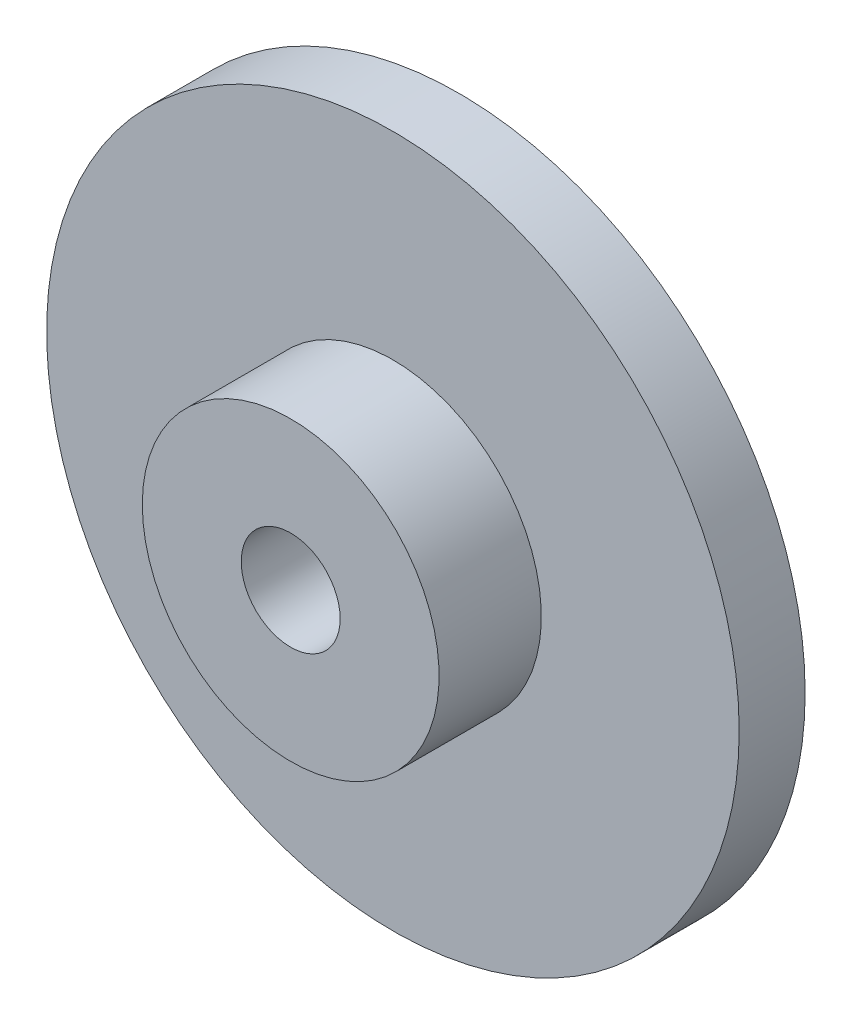
ISO-10303-21;
HEADER;
FILE_DESCRIPTION(('STEP AP214'),'2;1');
FILE_NAME('part.step','',(''),(''),'','','');
FILE_SCHEMA(('AUTOMOTIVE_DESIGN { 1 0 10303 214 1 1 1 1 }'));
ENDSEC;
DATA;
#1=APPLICATION_CONTEXT('core data for automotive mechanical design processes');
#2=APPLICATION_PROTOCOL_DEFINITION('international standard','automotive_design',2000,#1);
#3=PRODUCT_CONTEXT('',#1,'mechanical');
#4=PRODUCT('Part','Part','',(#3));
#5=PRODUCT_RELATED_PRODUCT_CATEGORY('part','',(#4));
#6=PRODUCT_DEFINITION_FORMATION('','',#4);
#7=PRODUCT_DEFINITION_CONTEXT('part definition',#1,'design');
#8=PRODUCT_DEFINITION('design','',#6,#7);
#9=PRODUCT_DEFINITION_SHAPE('','',#8);
#10=(LENGTH_UNIT() NAMED_UNIT(*) SI_UNIT(.MILLI.,.METRE.));
#11=(NAMED_UNIT(*) PLANE_ANGLE_UNIT() SI_UNIT($,.RADIAN.));
#12=(NAMED_UNIT(*) SI_UNIT($,.STERADIAN.) SOLID_ANGLE_UNIT());
#13=UNCERTAINTY_MEASURE_WITH_UNIT(LENGTH_MEASURE(1.E-05),#10,'distance_accuracy_value','');
#14=(GEOMETRIC_REPRESENTATION_CONTEXT(3) GLOBAL_UNCERTAINTY_ASSIGNED_CONTEXT((#13)) GLOBAL_UNIT_ASSIGNED_CONTEXT((#10,
#11,#12)) REPRESENTATION_CONTEXT('',''));
#15=CARTESIAN_POINT('',(0.,0.,0.));
#16=DIRECTION('',(0.,0.,1.));
#17=DIRECTION('',(1.,0.,0.));
#18=AXIS2_PLACEMENT_3D('',#15,#16,#17);
#19=CARTESIAN_POINT('',(0.,0.,2.));
#20=DIRECTION('',(0.,0.,1.));
#21=DIRECTION('',(1.,0.,0.));
#22=AXIS2_PLACEMENT_3D('',#19,#20,#21);
#23=PLANE('',#22);
#24=CARTESIAN_POINT('',(0.,0.,2.));
#25=DIRECTION('',(0.,0.,1.));
#26=DIRECTION('',(1.,0.,0.));
#27=AXIS2_PLACEMENT_3D('',#24,#25,#26);
#28=CIRCLE('',#27,10.5);
#29=CARTESIAN_POINT('',(10.5,0.,2.));
#30=VERTEX_POINT('',#29);
#31=EDGE_CURVE('E10',#30,#30,#28,.T.);
#32=ORIENTED_EDGE('',*,*,#31,.T.);
#33=EDGE_LOOP('',(#32));
#34=FACE_BOUND('',#33,.T.);
#35=CARTESIAN_POINT('',(0.,0.,2.));
#36=DIRECTION('',(0.,0.,1.));
#37=DIRECTION('',(1.,0.,0.));
#38=AXIS2_PLACEMENT_3D('',#35,#36,#37);
#39=CIRCLE('',#38,4.5);
#40=CARTESIAN_POINT('',(-4.5,0.,2.));
#41=VERTEX_POINT('',#40);
#42=EDGE_CURVE('E48',#41,#41,#39,.T.);
#43=ORIENTED_EDGE('',*,*,#42,.F.);
#44=EDGE_LOOP('',(#43));
#45=FACE_BOUND('',#44,.T.);
#46=ADVANCED_FACE('F35',(#34,#45),#23,.T.);
#47=CARTESIAN_POINT('',(0.,0.,2.));
#48=DIRECTION('',(0.,0.,-1.));
#49=DIRECTION('',(-1.,0.,0.));
#50=AXIS2_PLACEMENT_3D('',#47,#48,#49);
#51=CYLINDRICAL_SURFACE('',#50,10.5);
#52=ORIENTED_EDGE('',*,*,#31,.F.);
#53=EDGE_LOOP('',(#52));
#54=FACE_BOUND('',#53,.T.);
#55=CARTESIAN_POINT('',(0.,0.,0.));
#56=DIRECTION('',(0.,0.,1.));
#57=DIRECTION('',(1.,0.,0.));
#58=AXIS2_PLACEMENT_3D('',#55,#56,#57);
#59=CIRCLE('',#58,10.5);
#60=CARTESIAN_POINT('',(10.5,0.,0.));
#61=VERTEX_POINT('',#60);
#62=EDGE_CURVE('E39',#61,#61,#59,.T.);
#63=ORIENTED_EDGE('',*,*,#62,.T.);
#64=EDGE_LOOP('',(#63));
#65=FACE_BOUND('',#64,.T.);
#66=ADVANCED_FACE('F37',(#54,#65),#51,.T.);
#67=CARTESIAN_POINT('',(0.,0.,0.));
#68=DIRECTION('',(0.,0.,1.));
#69=DIRECTION('',(1.,0.,0.));
#70=AXIS2_PLACEMENT_3D('',#67,#68,#69);
#71=PLANE('',#70);
#72=CARTESIAN_POINT('',(0.,0.,0.));
#73=DIRECTION('',(0.,0.,1.));
#74=DIRECTION('',(1.,0.,0.));
#75=AXIS2_PLACEMENT_3D('',#72,#73,#74);
#76=CIRCLE('',#75,1.5);
#77=CARTESIAN_POINT('',(1.5,0.,0.));
#78=VERTEX_POINT('',#77);
#79=EDGE_CURVE('E51',#78,#78,#76,.F.);
#80=ORIENTED_EDGE('',*,*,#79,.F.);
#81=EDGE_LOOP('',(#80));
#82=FACE_BOUND('',#81,.T.);
#83=ORIENTED_EDGE('',*,*,#62,.F.);
#84=EDGE_LOOP('',(#83));
#85=FACE_BOUND('',#84,.T.);
#86=ADVANCED_FACE('F72',(#82,#85),#71,.F.);
#87=CARTESIAN_POINT('',(0.,0.,5.1));
#88=DIRECTION('',(0.,0.,-1.));
#89=DIRECTION('',(-1.,0.,0.));
#90=AXIS2_PLACEMENT_3D('',#87,#88,#89);
#91=CYLINDRICAL_SURFACE('',#90,4.5);
#92=CARTESIAN_POINT('',(0.,0.,5.1));
#93=DIRECTION('',(0.,0.,1.));
#94=DIRECTION('',(1.,0.,0.));
#95=AXIS2_PLACEMENT_3D('',#92,#93,#94);
#96=CIRCLE('',#95,4.5);
#97=CARTESIAN_POINT('',(-4.5,0.,5.1));
#98=VERTEX_POINT('',#97);
#99=EDGE_CURVE('E46',#98,#98,#96,.T.);
#100=CARTESIAN_POINT('',(-4.5,0.,5.1));
#101=CARTESIAN_POINT('',(-4.5,0.,5.06770833333333));
#102=CARTESIAN_POINT('',(-4.5,0.,5.03541666666667));
#103=CARTESIAN_POINT('',(-4.5,0.,4.97083333333333));
#104=CARTESIAN_POINT('',(-4.5,0.,4.93854166666667));
#105=CARTESIAN_POINT('',(-4.5,0.,4.87395833333333));
#106=CARTESIAN_POINT('',(-4.5,0.,4.84166666666667));
#107=CARTESIAN_POINT('',(-4.5,0.,4.77708333333333));
#108=CARTESIAN_POINT('',(-4.5,0.,4.74479166666667));
#109=CARTESIAN_POINT('',(-4.5,0.,4.68020833333333));
#110=CARTESIAN_POINT('',(-4.5,0.,4.64791666666667));
#111=CARTESIAN_POINT('',(-4.5,0.,4.58333333333333));
#112=CARTESIAN_POINT('',(-4.5,0.,4.55104166666667));
#113=CARTESIAN_POINT('',(-4.5,0.,4.48645833333333));
#114=CARTESIAN_POINT('',(-4.5,0.,4.45416666666667));
#115=CARTESIAN_POINT('',(-4.5,0.,4.38958333333333));
#116=CARTESIAN_POINT('',(-4.5,0.,4.35729166666667));
#117=CARTESIAN_POINT('',(-4.5,0.,4.29270833333333));
#118=CARTESIAN_POINT('',(-4.5,0.,4.26041666666667));
#119=CARTESIAN_POINT('',(-4.5,0.,4.19583333333333));
#120=CARTESIAN_POINT('',(-4.5,0.,4.16354166666667));
#121=CARTESIAN_POINT('',(-4.5,0.,4.09895833333333));
#122=CARTESIAN_POINT('',(-4.5,0.,4.06666666666667));
#123=CARTESIAN_POINT('',(-4.5,0.,4.00208333333333));
#124=CARTESIAN_POINT('',(-4.5,0.,3.96979166666667));
#125=CARTESIAN_POINT('',(-4.5,0.,3.90520833333333));
#126=CARTESIAN_POINT('',(-4.5,0.,3.87291666666667));
#127=CARTESIAN_POINT('',(-4.5,0.,3.80833333333333));
#128=CARTESIAN_POINT('',(-4.5,0.,3.77604166666667));
#129=CARTESIAN_POINT('',(-4.5,0.,3.71145833333333));
#130=CARTESIAN_POINT('',(-4.5,0.,3.67916666666667));
#131=CARTESIAN_POINT('',(-4.5,0.,3.61458333333333));
#132=CARTESIAN_POINT('',(-4.5,0.,3.58229166666667));
#133=CARTESIAN_POINT('',(-4.5,0.,3.51770833333333));
#134=CARTESIAN_POINT('',(-4.5,0.,3.48541666666667));
#135=CARTESIAN_POINT('',(-4.5,0.,3.42083333333333));
#136=CARTESIAN_POINT('',(-4.5,0.,3.38854166666667));
#137=CARTESIAN_POINT('',(-4.5,0.,3.32395833333333));
#138=CARTESIAN_POINT('',(-4.5,0.,3.29166666666667));
#139=CARTESIAN_POINT('',(-4.5,0.,3.22708333333333));
#140=CARTESIAN_POINT('',(-4.5,0.,3.19479166666667));
#141=CARTESIAN_POINT('',(-4.5,0.,3.13020833333333));
#142=CARTESIAN_POINT('',(-4.5,0.,3.09791666666667));
#143=CARTESIAN_POINT('',(-4.5,0.,3.03333333333333));
#144=CARTESIAN_POINT('',(-4.5,0.,3.00104166666667));
#145=CARTESIAN_POINT('',(-4.5,0.,2.93645833333333));
#146=CARTESIAN_POINT('',(-4.5,0.,2.90416666666667));
#147=CARTESIAN_POINT('',(-4.5,0.,2.83958333333333));
#148=CARTESIAN_POINT('',(-4.5,0.,2.80729166666667));
#149=CARTESIAN_POINT('',(-4.5,0.,2.74270833333333));
#150=CARTESIAN_POINT('',(-4.5,0.,2.71041666666667));
#151=CARTESIAN_POINT('',(-4.5,0.,2.64583333333333));
#152=CARTESIAN_POINT('',(-4.5,0.,2.61354166666667));
#153=CARTESIAN_POINT('',(-4.5,0.,2.54895833333333));
#154=CARTESIAN_POINT('',(-4.5,0.,2.51666666666667));
#155=CARTESIAN_POINT('',(-4.5,0.,2.45208333333333));
#156=CARTESIAN_POINT('',(-4.5,0.,2.41979166666667));
#157=CARTESIAN_POINT('',(-4.5,0.,2.35520833333333));
#158=CARTESIAN_POINT('',(-4.5,0.,2.32291666666667));
#159=CARTESIAN_POINT('',(-4.5,0.,2.25833333333333));
#160=CARTESIAN_POINT('',(-4.5,0.,2.22604166666667));
#161=CARTESIAN_POINT('',(-4.5,0.,2.16145833333333));
#162=CARTESIAN_POINT('',(-4.5,0.,2.12916666666667));
#163=CARTESIAN_POINT('',(-4.5,0.,2.06458333333333));
#164=CARTESIAN_POINT('',(-4.5,0.,2.03229166666667));
#165=CARTESIAN_POINT('',(-4.5,0.,2.));
#166=B_SPLINE_CURVE_WITH_KNOTS('',3,(#100,#101,#102,#103,#104,#105,#106,#107,#108,#109,#110,
#111,#112,#113,#114,#115,#116,#117,#118,#119,#120,#121,#122,#123,#124,#125,#126,#127,#128,#129,
#130,#131,#132,#133,#134,#135,#136,#137,#138,#139,#140,#141,#142,#143,#144,#145,#146,#147,#148,
#149,#150,#151,#152,#153,#154,#155,#156,#157,#158,#159,#160,#161,#162,#163,#164,#165),
.UNSPECIFIED.,.F.,.F.,(4,2,2,2,2,2,2,2,2,2,2,2,2,2,2,2,2,2,2,2,2,2,2,2,2,2,2,2,2,2,2,2,4),(0.,
0.0968749999999997,0.193749999999999,0.290624999999999,0.3875,0.484375,0.581249999999999,
0.678125,0.775,0.871874999999999,0.96875,1.065625,1.1625,1.259375,1.35625,1.453125,1.55,
1.646875,1.74375,1.840625,1.9375,2.034375,2.13125,2.228125,2.325,2.421875,2.51875,2.615625,
2.7125,2.809375,2.90625,3.003125,3.1),.UNSPECIFIED.);
#167=EDGE_CURVE('BSEAM66',#98,#41,#166,.T.);
#168=ORIENTED_EDGE('',*,*,#99,.F.);
#169=ORIENTED_EDGE('',*,*,#42,.T.);
#170=ORIENTED_EDGE('',*,*,#167,.T.);
#171=ORIENTED_EDGE('',*,*,#167,.F.);
#172=EDGE_LOOP('',(#168,#170,#169,#171));
#173=FACE_BOUND('',#172,.T.);
#174=ADVANCED_FACE('F66',(#173),#91,.T.);
#175=CARTESIAN_POINT('',(0.,0.,5.1));
#176=DIRECTION('',(0.,0.,1.));
#177=DIRECTION('',(1.,0.,0.));
#178=AXIS2_PLACEMENT_3D('',#175,#176,#177);
#179=PLANE('',#178);
#180=CARTESIAN_POINT('',(0.,0.,5.1));
#181=DIRECTION('',(0.,0.,1.));
#182=DIRECTION('',(1.,0.,0.));
#183=AXIS2_PLACEMENT_3D('',#180,#181,#182);
#184=CIRCLE('',#183,1.5);
#185=CARTESIAN_POINT('',(1.5,0.,5.1));
#186=VERTEX_POINT('',#185);
#187=EDGE_CURVE('E56',#186,#186,#184,.T.);
#188=ORIENTED_EDGE('',*,*,#187,.F.);
#189=EDGE_LOOP('',(#188));
#190=FACE_BOUND('',#189,.T.);
#191=ORIENTED_EDGE('',*,*,#99,.T.);
#192=EDGE_LOOP('',(#191));
#193=FACE_BOUND('',#192,.T.);
#194=ADVANCED_FACE('F63',(#190,#193),#179,.T.);
#195=CARTESIAN_POINT('',(0.,0.,-0.00100000000000013));
#196=DIRECTION('',(0.,0.,1.));
#197=DIRECTION('',(1.,0.,0.));
#198=AXIS2_PLACEMENT_3D('',#195,#196,#197);
#199=CYLINDRICAL_SURFACE('',#198,1.5);
#200=CARTESIAN_POINT('',(1.5,0.,5.1));
#201=CARTESIAN_POINT('',(1.5,0.,5.046875));
#202=CARTESIAN_POINT('',(1.5,0.,4.99375));
#203=CARTESIAN_POINT('',(1.5,0.,4.8875));
#204=CARTESIAN_POINT('',(1.5,0.,4.834375));
#205=CARTESIAN_POINT('',(1.5,0.,4.728125));
#206=CARTESIAN_POINT('',(1.5,0.,4.675));
#207=CARTESIAN_POINT('',(1.5,0.,4.56875));
#208=CARTESIAN_POINT('',(1.5,0.,4.515625));
#209=CARTESIAN_POINT('',(1.5,0.,4.409375));
#210=CARTESIAN_POINT('',(1.5,0.,4.35625));
#211=CARTESIAN_POINT('',(1.5,0.,4.25));
#212=CARTESIAN_POINT('',(1.5,0.,4.196875));
#213=CARTESIAN_POINT('',(1.5,0.,4.090625));
#214=CARTESIAN_POINT('',(1.5,0.,4.0375));
#215=CARTESIAN_POINT('',(1.5,0.,3.93125));
#216=CARTESIAN_POINT('',(1.5,0.,3.878125));
#217=CARTESIAN_POINT('',(1.5,0.,3.771875));
#218=CARTESIAN_POINT('',(1.5,0.,3.71875));
#219=CARTESIAN_POINT('',(1.5,0.,3.6125));
#220=CARTESIAN_POINT('',(1.5,0.,3.559375));
#221=CARTESIAN_POINT('',(1.5,0.,3.453125));
#222=CARTESIAN_POINT('',(1.5,0.,3.4));
#223=CARTESIAN_POINT('',(1.5,0.,3.29375));
#224=CARTESIAN_POINT('',(1.5,0.,3.240625));
#225=CARTESIAN_POINT('',(1.5,0.,3.134375));
#226=CARTESIAN_POINT('',(1.5,0.,3.08125));
#227=CARTESIAN_POINT('',(1.5,0.,2.975));
#228=CARTESIAN_POINT('',(1.5,0.,2.921875));
#229=CARTESIAN_POINT('',(1.5,0.,2.815625));
#230=CARTESIAN_POINT('',(1.5,0.,2.7625));
#231=CARTESIAN_POINT('',(1.5,0.,2.65625));
#232=CARTESIAN_POINT('',(1.5,0.,2.603125));
#233=CARTESIAN_POINT('',(1.5,0.,2.496875));
#234=CARTESIAN_POINT('',(1.5,0.,2.44375));
#235=CARTESIAN_POINT('',(1.5,0.,2.3375));
#236=CARTESIAN_POINT('',(1.5,0.,2.284375));
#237=CARTESIAN_POINT('',(1.5,0.,2.178125));
#238=CARTESIAN_POINT('',(1.5,0.,2.125));
#239=CARTESIAN_POINT('',(1.5,0.,2.01875));
#240=CARTESIAN_POINT('',(1.5,0.,1.965625));
#241=CARTESIAN_POINT('',(1.5,0.,1.859375));
#242=CARTESIAN_POINT('',(1.5,0.,1.80625));
#243=CARTESIAN_POINT('',(1.5,0.,1.7));
#244=CARTESIAN_POINT('',(1.5,0.,1.646875));
#245=CARTESIAN_POINT('',(1.5,0.,1.540625));
#246=CARTESIAN_POINT('',(1.5,0.,1.4875));
#247=CARTESIAN_POINT('',(1.5,0.,1.38125));
#248=CARTESIAN_POINT('',(1.5,0.,1.328125));
#249=CARTESIAN_POINT('',(1.5,0.,1.221875));
#250=CARTESIAN_POINT('',(1.5,0.,1.16875));
#251=CARTESIAN_POINT('',(1.5,0.,1.0625));
#252=CARTESIAN_POINT('',(1.5,0.,1.009375));
#253=CARTESIAN_POINT('',(1.5,0.,0.903125));
#254=CARTESIAN_POINT('',(1.5,0.,0.85));
#255=CARTESIAN_POINT('',(1.5,0.,0.74375));
#256=CARTESIAN_POINT('',(1.5,0.,0.690625));
#257=CARTESIAN_POINT('',(1.5,0.,0.584375));
#258=CARTESIAN_POINT('',(1.5,0.,0.53125));
#259=CARTESIAN_POINT('',(1.5,0.,0.425));
#260=CARTESIAN_POINT('',(1.5,0.,0.371875));
#261=CARTESIAN_POINT('',(1.5,0.,0.265625));
#262=CARTESIAN_POINT('',(1.5,0.,0.2125));
#263=CARTESIAN_POINT('',(1.5,0.,0.10625));
#264=CARTESIAN_POINT('',(1.5,0.,0.0531249999999999));
#265=CARTESIAN_POINT('',(1.5,0.,0.));
#266=B_SPLINE_CURVE_WITH_KNOTS('',3,(#200,#201,#202,#203,#204,#205,#206,#207,#208,#209,#210,
#211,#212,#213,#214,#215,#216,#217,#218,#219,#220,#221,#222,#223,#224,#225,#226,#227,#228,#229,
#230,#231,#232,#233,#234,#235,#236,#237,#238,#239,#240,#241,#242,#243,#244,#245,#246,#247,#248,
#249,#250,#251,#252,#253,#254,#255,#256,#257,#258,#259,#260,#261,#262,#263,#264,#265),
.UNSPECIFIED.,.F.,.F.,(4,2,2,2,2,2,2,2,2,2,2,2,2,2,2,2,2,2,2,2,2,2,2,2,2,2,2,2,2,2,2,2,4),(0.,
0.159375,0.31875,0.478125,0.6375,0.796875,0.95625,1.115625,1.275,1.434375,1.59375,1.753125,
1.9125,2.071875,2.23125,2.390625,2.55,2.709375,2.86875,3.028125,3.1875,3.346875,3.50625,
3.665625,3.825,3.984375,4.14375,4.303125,4.4625,4.621875,4.78125,4.940625,5.1),.UNSPECIFIED.);
#267=EDGE_CURVE('BSEAM60',#186,#78,#266,.T.);
#268=ORIENTED_EDGE('',*,*,#187,.T.);
#269=ORIENTED_EDGE('',*,*,#79,.T.);
#270=ORIENTED_EDGE('',*,*,#267,.T.);
#271=ORIENTED_EDGE('',*,*,#267,.F.);
#272=EDGE_LOOP('',(#268,#270,#269,#271));
#273=FACE_BOUND('',#272,.T.);
#274=ADVANCED_FACE('F60',(#273),#199,.F.);
#275=CLOSED_SHELL('',(#46,#66,#86,#174,#194,#274));
#276=MANIFOLD_SOLID_BREP('B2',#275);
#277=ADVANCED_BREP_SHAPE_REPRESENTATION('',(#18,#276),#14);
#278=SHAPE_DEFINITION_REPRESENTATION(#9,#277);
ENDSEC;
END-ISO-10303-21;
